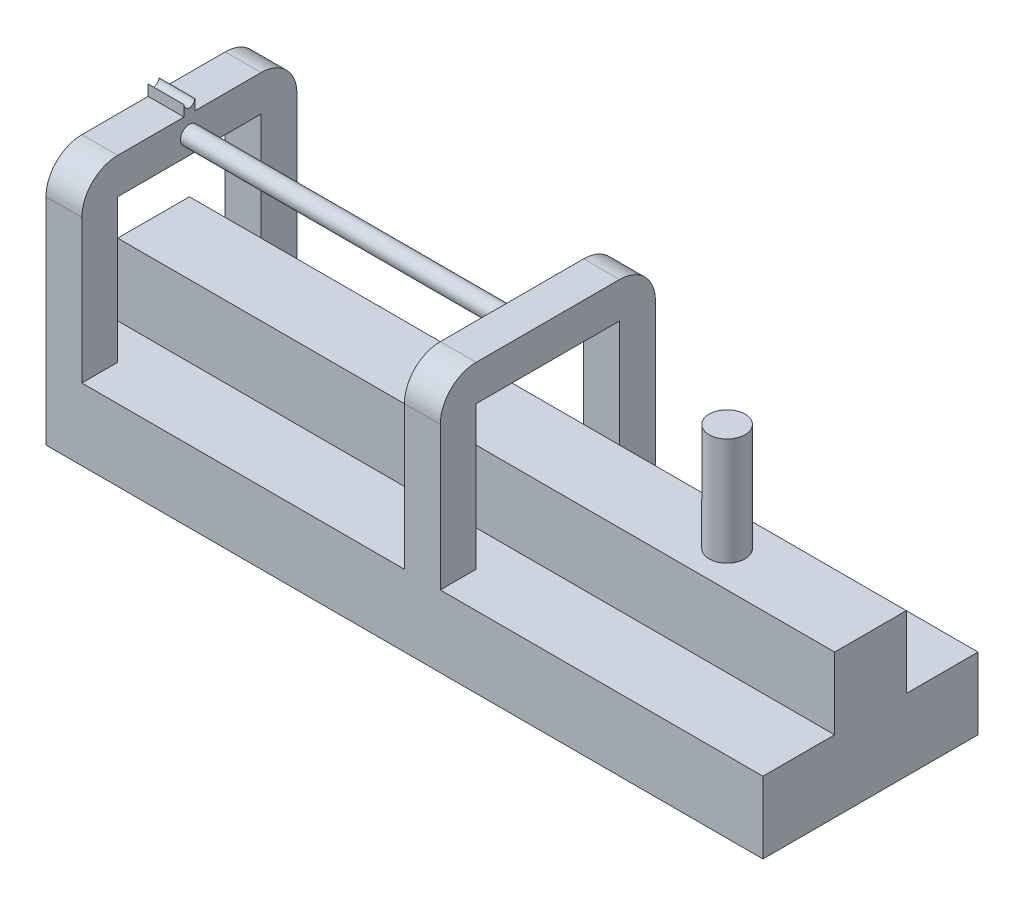
ISO-10303-21;
HEADER;
FILE_DESCRIPTION(('STEP AP214'),'2;1');
FILE_NAME('part.step','',(''),(''),'','','');
FILE_SCHEMA(('AUTOMOTIVE_DESIGN { 1 0 10303 214 1 1 1 1 }'));
ENDSEC;
DATA;
#1=APPLICATION_CONTEXT('core data for automotive mechanical design processes');
#2=APPLICATION_PROTOCOL_DEFINITION('international standard','automotive_design',2000,#1);
#3=PRODUCT_CONTEXT('',#1,'mechanical');
#4=PRODUCT('Part','Part','',(#3));
#5=PRODUCT_RELATED_PRODUCT_CATEGORY('part','',(#4));
#6=PRODUCT_DEFINITION_FORMATION('','',#4);
#7=PRODUCT_DEFINITION_CONTEXT('part definition',#1,'design');
#8=PRODUCT_DEFINITION('design','',#6,#7);
#9=PRODUCT_DEFINITION_SHAPE('','',#8);
#10=(LENGTH_UNIT() NAMED_UNIT(*) SI_UNIT(.MILLI.,.METRE.));
#11=(NAMED_UNIT(*) PLANE_ANGLE_UNIT() SI_UNIT($,.RADIAN.));
#12=(NAMED_UNIT(*) SI_UNIT($,.STERADIAN.) SOLID_ANGLE_UNIT());
#13=UNCERTAINTY_MEASURE_WITH_UNIT(LENGTH_MEASURE(1.E-05),#10,'distance_accuracy_value','');
#14=(GEOMETRIC_REPRESENTATION_CONTEXT(3) GLOBAL_UNCERTAINTY_ASSIGNED_CONTEXT((#13)) GLOBAL_UNIT_ASSIGNED_CONTEXT((#10,
#11,#12)) REPRESENTATION_CONTEXT('',''));
#15=CARTESIAN_POINT('',(0.,0.,0.));
#16=DIRECTION('',(0.,0.,1.));
#17=DIRECTION('',(1.,0.,0.));
#18=AXIS2_PLACEMENT_3D('',#15,#16,#17);
#19=CARTESIAN_POINT('',(10.,70.,-30.));
#20=DIRECTION('',(0.,1.,0.));
#21=DIRECTION('',(0.,0.,1.));
#22=AXIS2_PLACEMENT_3D('',#19,#20,#21);
#23=PLANE('',#22);
#24=DIRECTION('',(-1.,0.,0.));
#25=VECTOR('',#24,1.);
#26=CARTESIAN_POINT('',(10.,70.,1.50000000000001));
#27=LINE('',#26,#25);
#28=CARTESIAN_POINT('',(10.,70.,1.50000000000001));
#29=VERTEX_POINT('',#28);
#30=CARTESIAN_POINT('',(0.,70.,1.5));
#31=VERTEX_POINT('',#30);
#32=EDGE_CURVE('E56',#29,#31,#27,.T.);
#33=ORIENTED_EDGE('',*,*,#32,.T.);
#34=DIRECTION('',(0.,0.,-1.));
#35=VECTOR('',#34,1.);
#36=CARTESIAN_POINT('',(0.,70.,-30.));
#37=LINE('',#36,#35);
#38=CARTESIAN_POINT('',(0.,70.,20.));
#39=VERTEX_POINT('',#38);
#40=EDGE_CURVE('E332',#39,#31,#37,.T.);
#41=ORIENTED_EDGE('',*,*,#40,.F.);
#42=DIRECTION('',(-1.,0.,0.));
#43=VECTOR('',#42,1.);
#44=CARTESIAN_POINT('',(10.,70.,20.));
#45=LINE('',#44,#43);
#46=CARTESIAN_POINT('',(10.,70.,20.));
#47=VERTEX_POINT('',#46);
#48=EDGE_CURVE('E442',#39,#47,#45,.F.);
#49=ORIENTED_EDGE('',*,*,#48,.T.);
#50=DIRECTION('',(0.,0.,-1.));
#51=VECTOR('',#50,1.);
#52=CARTESIAN_POINT('',(10.,70.,-30.));
#53=LINE('',#52,#51);
#54=EDGE_CURVE('E349',#47,#29,#53,.T.);
#55=ORIENTED_EDGE('',*,*,#54,.T.);
#56=EDGE_LOOP('',(#33,#41,#49,#55));
#57=FACE_BOUND('',#56,.T.);
#58=ADVANCED_FACE('F33',(#57),#23,.T.);
#59=CARTESIAN_POINT('',(200.,0.,30.));
#60=DIRECTION('',(0.,0.,-1.));
#61=DIRECTION('',(-1.,0.,0.));
#62=AXIS2_PLACEMENT_3D('',#59,#60,#61);
#63=PLANE('',#62);
#64=DIRECTION('',(0.,1.,0.));
#65=VECTOR('',#64,1.);
#66=CARTESIAN_POINT('',(10.,20.,30.));
#67=LINE('',#66,#65);
#68=CARTESIAN_POINT('',(10.,20.,30.));
#69=VERTEX_POINT('',#68);
#70=CARTESIAN_POINT('',(10.,60.,30.));
#71=VERTEX_POINT('',#70);
#72=EDGE_CURVE('E346',#69,#71,#67,.T.);
#73=ORIENTED_EDGE('',*,*,#72,.T.);
#74=DIRECTION('',(-1.,0.,0.));
#75=VECTOR('',#74,1.);
#76=CARTESIAN_POINT('',(0.,60.,30.));
#77=LINE('',#76,#75);
#78=CARTESIAN_POINT('',(0.,60.,30.));
#79=VERTEX_POINT('',#78);
#80=EDGE_CURVE('E433',#71,#79,#77,.T.);
#81=ORIENTED_EDGE('',*,*,#80,.T.);
#82=DIRECTION('',(0.,-1.,0.));
#83=VECTOR('',#82,1.);
#84=CARTESIAN_POINT('',(0.,0.,30.));
#85=LINE('',#84,#83);
#86=CARTESIAN_POINT('',(0.,0.,30.));
#87=VERTEX_POINT('',#86);
#88=EDGE_CURVE('E364',#79,#87,#85,.T.);
#89=ORIENTED_EDGE('',*,*,#88,.T.);
#90=DIRECTION('',(-1.,0.,0.));
#91=VECTOR('',#90,1.);
#92=CARTESIAN_POINT('',(200.,0.,30.));
#93=LINE('',#92,#91);
#94=CARTESIAN_POINT('',(200.,0.,30.));
#95=VERTEX_POINT('',#94);
#96=EDGE_CURVE('E427',#95,#87,#93,.T.);
#97=ORIENTED_EDGE('',*,*,#96,.F.);
#98=DIRECTION('',(0.,-1.,0.));
#99=VECTOR('',#98,1.);
#100=CARTESIAN_POINT('',(200.,0.,30.));
#101=LINE('',#100,#99);
#102=CARTESIAN_POINT('',(200.,20.,30.));
#103=VERTEX_POINT('',#102);
#104=EDGE_CURVE('E371',#103,#95,#101,.T.);
#105=ORIENTED_EDGE('',*,*,#104,.F.);
#106=DIRECTION('',(-1.,0.,0.));
#107=VECTOR('',#106,1.);
#108=CARTESIAN_POINT('',(200.,20.,30.));
#109=LINE('',#108,#107);
#110=CARTESIAN_POINT('',(110.,20.,30.));
#111=VERTEX_POINT('',#110);
#112=EDGE_CURVE('E405',#103,#111,#109,.T.);
#113=ORIENTED_EDGE('',*,*,#112,.T.);
#114=DIRECTION('',(0.,1.,0.));
#115=VECTOR('',#114,1.);
#116=CARTESIAN_POINT('',(110.,20.,30.));
#117=LINE('',#116,#115);
#118=CARTESIAN_POINT('',(110.,60.,30.));
#119=VERTEX_POINT('',#118);
#120=EDGE_CURVE('E292',#111,#119,#117,.T.);
#121=ORIENTED_EDGE('',*,*,#120,.T.);
#122=DIRECTION('',(-1.,0.,0.));
#123=VECTOR('',#122,1.);
#124=CARTESIAN_POINT('',(100.,60.,30.));
#125=LINE('',#124,#123);
#126=CARTESIAN_POINT('',(100.,60.,30.));
#127=VERTEX_POINT('',#126);
#128=EDGE_CURVE('E430',#119,#127,#125,.T.);
#129=ORIENTED_EDGE('',*,*,#128,.T.);
#130=DIRECTION('',(0.,1.,0.));
#131=VECTOR('',#130,1.);
#132=CARTESIAN_POINT('',(100.,20.,30.));
#133=LINE('',#132,#131);
#134=CARTESIAN_POINT('',(100.,20.,30.));
#135=VERTEX_POINT('',#134);
#136=EDGE_CURVE('E315',#135,#127,#133,.T.);
#137=ORIENTED_EDGE('',*,*,#136,.F.);
#138=EDGE_CURVE('E389',#135,#69,#109,.T.);
#139=ORIENTED_EDGE('',*,*,#138,.T.);
#140=EDGE_LOOP('',(#73,#81,#89,#97,#105,#113,#121,#129,#137,#139));
#141=FACE_BOUND('',#140,.T.);
#142=ADVANCED_FACE('F478',(#141),#63,.F.);
#143=CARTESIAN_POINT('',(200.,0.,-30.));
#144=DIRECTION('',(0.,1.,0.));
#145=DIRECTION('',(0.,0.,1.));
#146=AXIS2_PLACEMENT_3D('',#143,#144,#145);
#147=PLANE('',#146);
#148=DIRECTION('',(0.,0.,-1.));
#149=VECTOR('',#148,1.);
#150=CARTESIAN_POINT('',(0.,0.,-30.));
#151=LINE('',#150,#149);
#152=CARTESIAN_POINT('',(0.,0.,-30.));
#153=VERTEX_POINT('',#152);
#154=EDGE_CURVE('E391',#87,#153,#151,.T.);
#155=ORIENTED_EDGE('',*,*,#154,.T.);
#156=DIRECTION('',(-1.,0.,0.));
#157=VECTOR('',#156,1.);
#158=CARTESIAN_POINT('',(200.,0.,-30.));
#159=LINE('',#158,#157);
#160=CARTESIAN_POINT('',(200.,0.,-30.));
#161=VERTEX_POINT('',#160);
#162=EDGE_CURVE('E424',#161,#153,#159,.T.);
#163=ORIENTED_EDGE('',*,*,#162,.F.);
#164=DIRECTION('',(0.,0.,-1.));
#165=VECTOR('',#164,1.);
#166=CARTESIAN_POINT('',(200.,0.,-30.));
#167=LINE('',#166,#165);
#168=EDGE_CURVE('E374',#95,#161,#167,.T.);
#169=ORIENTED_EDGE('',*,*,#168,.F.);
#170=ORIENTED_EDGE('',*,*,#96,.T.);
#171=EDGE_LOOP('',(#155,#163,#169,#170));
#172=FACE_BOUND('',#171,.T.);
#173=ADVANCED_FACE('F594',(#172),#147,.F.);
#174=CARTESIAN_POINT('',(200.,0.,-30.));
#175=DIRECTION('',(0.,0.,1.));
#176=DIRECTION('',(1.,0.,0.));
#177=AXIS2_PLACEMENT_3D('',#174,#175,#176);
#178=PLANE('',#177);
#179=DIRECTION('',(0.,1.,0.));
#180=VECTOR('',#179,1.);
#181=CARTESIAN_POINT('',(0.,0.,-30.));
#182=LINE('',#181,#180);
#183=CARTESIAN_POINT('',(0.,60.,-30.));
#184=VERTEX_POINT('',#183);
#185=EDGE_CURVE('E393',#153,#184,#182,.T.);
#186=ORIENTED_EDGE('',*,*,#185,.T.);
#187=DIRECTION('',(-1.,0.,0.));
#188=VECTOR('',#187,1.);
#189=CARTESIAN_POINT('',(10.,60.,-30.));
#190=LINE('',#189,#188);
#191=CARTESIAN_POINT('',(10.,60.,-30.));
#192=VERTEX_POINT('',#191);
#193=EDGE_CURVE('E450',#184,#192,#190,.F.);
#194=ORIENTED_EDGE('',*,*,#193,.T.);
#195=DIRECTION('',(0.,-1.,0.));
#196=VECTOR('',#195,1.);
#197=CARTESIAN_POINT('',(10.,20.,-30.));
#198=LINE('',#197,#196);
#199=CARTESIAN_POINT('',(10.,20.,-30.));
#200=VERTEX_POINT('',#199);
#201=EDGE_CURVE('E329',#192,#200,#198,.T.);
#202=ORIENTED_EDGE('',*,*,#201,.T.);
#203=DIRECTION('',(-1.,0.,0.));
#204=VECTOR('',#203,1.);
#205=CARTESIAN_POINT('',(200.,20.,-30.));
#206=LINE('',#205,#204);
#207=CARTESIAN_POINT('',(100.,20.,-30.));
#208=VERTEX_POINT('',#207);
#209=EDGE_CURVE('E420',#208,#200,#206,.T.);
#210=ORIENTED_EDGE('',*,*,#209,.F.);
#211=DIRECTION('',(0.,-1.,0.));
#212=VECTOR('',#211,1.);
#213=CARTESIAN_POINT('',(100.,20.,-30.));
#214=LINE('',#213,#212);
#215=CARTESIAN_POINT('',(100.,60.,-30.));
#216=VERTEX_POINT('',#215);
#217=EDGE_CURVE('E275',#216,#208,#214,.T.);
#218=ORIENTED_EDGE('',*,*,#217,.F.);
#219=DIRECTION('',(-1.,0.,0.));
#220=VECTOR('',#219,1.);
#221=CARTESIAN_POINT('',(110.,60.,-30.));
#222=LINE('',#221,#220);
#223=CARTESIAN_POINT('',(110.,60.,-30.));
#224=VERTEX_POINT('',#223);
#225=EDGE_CURVE('E448',#216,#224,#222,.F.);
#226=ORIENTED_EDGE('',*,*,#225,.T.);
#227=DIRECTION('',(0.,-1.,0.));
#228=VECTOR('',#227,1.);
#229=CARTESIAN_POINT('',(110.,20.,-30.));
#230=LINE('',#229,#228);
#231=CARTESIAN_POINT('',(110.,20.,-30.));
#232=VERTEX_POINT('',#231);
#233=EDGE_CURVE('E276',#224,#232,#230,.T.);
#234=ORIENTED_EDGE('',*,*,#233,.T.);
#235=CARTESIAN_POINT('',(200.,20.,-30.));
#236=VERTEX_POINT('',#235);
#237=EDGE_CURVE('E421',#236,#232,#206,.T.);
#238=ORIENTED_EDGE('',*,*,#237,.F.);
#239=DIRECTION('',(0.,1.,0.));
#240=VECTOR('',#239,1.);
#241=CARTESIAN_POINT('',(200.,0.,-30.));
#242=LINE('',#241,#240);
#243=EDGE_CURVE('E377',#161,#236,#242,.T.);
#244=ORIENTED_EDGE('',*,*,#243,.F.);
#245=ORIENTED_EDGE('',*,*,#162,.T.);
#246=EDGE_LOOP('',(#186,#194,#202,#210,#218,#226,#234,#238,#244,#245));
#247=FACE_BOUND('',#246,.T.);
#248=ADVANCED_FACE('F499',(#247),#178,.F.);
#249=CARTESIAN_POINT('',(200.,20.,-30.));
#250=DIRECTION('',(0.,-1.,0.));
#251=DIRECTION('',(0.,0.,-1.));
#252=AXIS2_PLACEMENT_3D('',#249,#250,#251);
#253=PLANE('',#252);
#254=ORIENTED_EDGE('',*,*,#237,.T.);
#255=DIRECTION('',(0.,0.,1.));
#256=VECTOR('',#255,1.);
#257=CARTESIAN_POINT('',(110.,20.,-30.));
#258=LINE('',#257,#256);
#259=CARTESIAN_POINT('',(110.,20.,-20.));
#260=VERTEX_POINT('',#259);
#261=EDGE_CURVE('E278',#232,#260,#258,.T.);
#262=ORIENTED_EDGE('',*,*,#261,.T.);
#263=DIRECTION('',(-1.,0.,0.));
#264=VECTOR('',#263,1.);
#265=CARTESIAN_POINT('',(110.,20.,-20.));
#266=LINE('',#265,#264);
#267=CARTESIAN_POINT('',(100.,20.,-20.));
#268=VERTEX_POINT('',#267);
#269=EDGE_CURVE('E298',#260,#268,#266,.T.);
#270=ORIENTED_EDGE('',*,*,#269,.T.);
#271=DIRECTION('',(0.,0.,1.));
#272=VECTOR('',#271,1.);
#273=CARTESIAN_POINT('',(100.,20.,-30.));
#274=LINE('',#273,#272);
#275=EDGE_CURVE('E300',#208,#268,#274,.T.);
#276=ORIENTED_EDGE('',*,*,#275,.F.);
#277=ORIENTED_EDGE('',*,*,#209,.T.);
#278=DIRECTION('',(0.,0.,1.));
#279=VECTOR('',#278,1.);
#280=CARTESIAN_POINT('',(10.,20.,-30.));
#281=LINE('',#280,#279);
#282=CARTESIAN_POINT('',(10.,20.,-20.));
#283=VERTEX_POINT('',#282);
#284=EDGE_CURVE('E331',#200,#283,#281,.T.);
#285=ORIENTED_EDGE('',*,*,#284,.T.);
#286=DIRECTION('',(-1.,0.,0.));
#287=VECTOR('',#286,1.);
#288=CARTESIAN_POINT('',(10.,20.,-20.));
#289=LINE('',#288,#287);
#290=CARTESIAN_POINT('',(0.,20.,-20.));
#291=VERTEX_POINT('',#290);
#292=EDGE_CURVE('E351',#283,#291,#289,.T.);
#293=ORIENTED_EDGE('',*,*,#292,.T.);
#294=DIRECTION('',(0.,0.,1.));
#295=VECTOR('',#294,1.);
#296=CARTESIAN_POINT('',(0.,20.,-30.));
#297=LINE('',#296,#295);
#298=CARTESIAN_POINT('',(0.,20.,-9.99999999999999));
#299=VERTEX_POINT('',#298);
#300=EDGE_CURVE('E396',#291,#299,#297,.T.);
#301=ORIENTED_EDGE('',*,*,#300,.T.);
#302=DIRECTION('',(-1.,0.,0.));
#303=VECTOR('',#302,1.);
#304=CARTESIAN_POINT('',(200.,20.,-9.99999999999999));
#305=LINE('',#304,#303);
#306=CARTESIAN_POINT('',(200.,20.,-9.99999999999999));
#307=VERTEX_POINT('',#306);
#308=EDGE_CURVE('E417',#307,#299,#305,.T.);
#309=ORIENTED_EDGE('',*,*,#308,.F.);
#310=DIRECTION('',(0.,0.,1.));
#311=VECTOR('',#310,1.);
#312=CARTESIAN_POINT('',(200.,20.,-30.));
#313=LINE('',#312,#311);
#314=EDGE_CURVE('E379',#236,#307,#313,.T.);
#315=ORIENTED_EDGE('',*,*,#314,.F.);
#316=EDGE_LOOP('',(#254,#262,#270,#276,#277,#285,#293,#301,#309,#315));
#317=FACE_BOUND('',#316,.T.);
#318=ADVANCED_FACE('F504',(#317),#253,.F.);
#319=CARTESIAN_POINT('',(200.,20.,-9.99999999999999));
#320=DIRECTION('',(0.,0.,1.));
#321=DIRECTION('',(0.,-1.,0.));
#322=AXIS2_PLACEMENT_3D('',#319,#320,#321);
#323=PLANE('',#322);
#324=DIRECTION('',(0.,1.,0.));
#325=VECTOR('',#324,1.);
#326=CARTESIAN_POINT('',(0.,20.,-9.99999999999999));
#327=LINE('',#326,#325);
#328=CARTESIAN_POINT('',(0.,40.,-10.));
#329=VERTEX_POINT('',#328);
#330=EDGE_CURVE('E398',#299,#329,#327,.T.);
#331=ORIENTED_EDGE('',*,*,#330,.T.);
#332=DIRECTION('',(-1.,0.,0.));
#333=VECTOR('',#332,1.);
#334=CARTESIAN_POINT('',(200.,40.,-10.));
#335=LINE('',#334,#333);
#336=CARTESIAN_POINT('',(200.,40.,-10.));
#337=VERTEX_POINT('',#336);
#338=EDGE_CURVE('E414',#337,#329,#335,.T.);
#339=ORIENTED_EDGE('',*,*,#338,.F.);
#340=DIRECTION('',(0.,1.,0.));
#341=VECTOR('',#340,1.);
#342=CARTESIAN_POINT('',(200.,20.,-9.99999999999999));
#343=LINE('',#342,#341);
#344=EDGE_CURVE('E381',#307,#337,#343,.T.);
#345=ORIENTED_EDGE('',*,*,#344,.F.);
#346=ORIENTED_EDGE('',*,*,#308,.T.);
#347=EDGE_LOOP('',(#331,#339,#345,#346));
#348=FACE_BOUND('',#347,.T.);
#349=ADVANCED_FACE('F520',(#348),#323,.F.);
#350=CARTESIAN_POINT('',(200.,40.,9.99999999999999));
#351=DIRECTION('',(0.,-1.,0.));
#352=DIRECTION('',(0.,0.,-1.));
#353=AXIS2_PLACEMENT_3D('',#350,#351,#352);
#354=PLANE('',#353);
#355=CARTESIAN_POINT('',(160.,40.,0.));
#356=DIRECTION('',(0.,-1.,0.));
#357=DIRECTION('',(0.,0.,-1.));
#358=AXIS2_PLACEMENT_3D('',#355,#356,#357);
#359=CIRCLE('',#358,4.99999999999999);
#360=CARTESIAN_POINT('',(160.,40.,-4.99999999999999));
#361=VERTEX_POINT('',#360);
#362=EDGE_CURVE('E11',#361,#361,#359,.F.);
#363=ORIENTED_EDGE('',*,*,#362,.F.);
#364=EDGE_LOOP('',(#363));
#365=FACE_BOUND('',#364,.T.);
#366=DIRECTION('',(0.,0.,1.));
#367=VECTOR('',#366,1.);
#368=CARTESIAN_POINT('',(0.,40.,9.99999999999999));
#369=LINE('',#368,#367);
#370=CARTESIAN_POINT('',(0.,40.,9.99999999999999));
#371=VERTEX_POINT('',#370);
#372=EDGE_CURVE('E400',#329,#371,#369,.T.);
#373=ORIENTED_EDGE('',*,*,#372,.T.);
#374=DIRECTION('',(-1.,0.,0.));
#375=VECTOR('',#374,1.);
#376=CARTESIAN_POINT('',(200.,40.,9.99999999999999));
#377=LINE('',#376,#375);
#378=CARTESIAN_POINT('',(200.,40.,9.99999999999999));
#379=VERTEX_POINT('',#378);
#380=EDGE_CURVE('E411',#379,#371,#377,.T.);
#381=ORIENTED_EDGE('',*,*,#380,.F.);
#382=DIRECTION('',(0.,0.,1.));
#383=VECTOR('',#382,1.);
#384=CARTESIAN_POINT('',(200.,40.,9.99999999999999));
#385=LINE('',#384,#383);
#386=EDGE_CURVE('E383',#337,#379,#385,.T.);
#387=ORIENTED_EDGE('',*,*,#386,.F.);
#388=ORIENTED_EDGE('',*,*,#338,.T.);
#389=EDGE_LOOP('',(#373,#381,#387,#388));
#390=FACE_BOUND('',#389,.T.);
#391=ADVANCED_FACE('F528',(#365,#390),#354,.F.);
#392=CARTESIAN_POINT('',(200.,20.,9.99999999999999));
#393=DIRECTION('',(0.,0.,-1.));
#394=DIRECTION('',(-1.,0.,0.));
#395=AXIS2_PLACEMENT_3D('',#392,#393,#394);
#396=PLANE('',#395);
#397=DIRECTION('',(0.,-1.,0.));
#398=VECTOR('',#397,1.);
#399=CARTESIAN_POINT('',(0.,20.,9.99999999999999));
#400=LINE('',#399,#398);
#401=CARTESIAN_POINT('',(0.,20.,9.99999999999999));
#402=VERTEX_POINT('',#401);
#403=EDGE_CURVE('E402',#371,#402,#400,.T.);
#404=ORIENTED_EDGE('',*,*,#403,.T.);
#405=DIRECTION('',(-1.,0.,0.));
#406=VECTOR('',#405,1.);
#407=CARTESIAN_POINT('',(200.,20.,9.99999999999999));
#408=LINE('',#407,#406);
#409=CARTESIAN_POINT('',(200.,20.,9.99999999999999));
#410=VERTEX_POINT('',#409);
#411=EDGE_CURVE('E408',#410,#402,#408,.T.);
#412=ORIENTED_EDGE('',*,*,#411,.F.);
#413=DIRECTION('',(0.,-1.,0.));
#414=VECTOR('',#413,1.);
#415=CARTESIAN_POINT('',(200.,20.,9.99999999999999));
#416=LINE('',#415,#414);
#417=EDGE_CURVE('E385',#379,#410,#416,.T.);
#418=ORIENTED_EDGE('',*,*,#417,.F.);
#419=ORIENTED_EDGE('',*,*,#380,.T.);
#420=EDGE_LOOP('',(#404,#412,#418,#419));
#421=FACE_BOUND('',#420,.T.);
#422=ADVANCED_FACE('F532',(#421),#396,.F.);
#423=CARTESIAN_POINT('',(200.,20.,30.));
#424=DIRECTION('',(0.,-1.,0.));
#425=DIRECTION('',(0.,0.,-1.));
#426=AXIS2_PLACEMENT_3D('',#423,#424,#425);
#427=PLANE('',#426);
#428=DIRECTION('',(-1.,0.,0.));
#429=VECTOR('',#428,1.);
#430=CARTESIAN_POINT('',(110.,20.,20.));
#431=LINE('',#430,#429);
#432=CARTESIAN_POINT('',(110.,20.,20.));
#433=VERTEX_POINT('',#432);
#434=CARTESIAN_POINT('',(100.,20.,20.));
#435=VERTEX_POINT('',#434);
#436=EDGE_CURVE('E320',#433,#435,#431,.T.);
#437=ORIENTED_EDGE('',*,*,#436,.F.);
#438=DIRECTION('',(0.,0.,1.));
#439=VECTOR('',#438,1.);
#440=CARTESIAN_POINT('',(110.,20.,20.));
#441=LINE('',#440,#439);
#442=EDGE_CURVE('E290',#433,#111,#441,.T.);
#443=ORIENTED_EDGE('',*,*,#442,.T.);
#444=ORIENTED_EDGE('',*,*,#112,.F.);
#445=DIRECTION('',(0.,0.,1.));
#446=VECTOR('',#445,1.);
#447=CARTESIAN_POINT('',(200.,20.,30.));
#448=LINE('',#447,#446);
#449=EDGE_CURVE('E387',#410,#103,#448,.T.);
#450=ORIENTED_EDGE('',*,*,#449,.F.);
#451=ORIENTED_EDGE('',*,*,#411,.T.);
#452=DIRECTION('',(0.,0.,1.));
#453=VECTOR('',#452,1.);
#454=CARTESIAN_POINT('',(0.,20.,30.));
#455=LINE('',#454,#453);
#456=CARTESIAN_POINT('',(0.,20.,20.));
#457=VERTEX_POINT('',#456);
#458=EDGE_CURVE('E375',#402,#457,#455,.T.);
#459=ORIENTED_EDGE('',*,*,#458,.T.);
#460=DIRECTION('',(-1.,0.,0.));
#461=VECTOR('',#460,1.);
#462=CARTESIAN_POINT('',(10.,20.,20.));
#463=LINE('',#462,#461);
#464=CARTESIAN_POINT('',(10.,20.,20.));
#465=VERTEX_POINT('',#464);
#466=EDGE_CURVE('E361',#465,#457,#463,.T.);
#467=ORIENTED_EDGE('',*,*,#466,.F.);
#468=DIRECTION('',(0.,0.,1.));
#469=VECTOR('',#468,1.);
#470=CARTESIAN_POINT('',(10.,20.,20.));
#471=LINE('',#470,#469);
#472=EDGE_CURVE('E343',#465,#69,#471,.T.);
#473=ORIENTED_EDGE('',*,*,#472,.T.);
#474=ORIENTED_EDGE('',*,*,#138,.F.);
#475=DIRECTION('',(0.,0.,1.));
#476=VECTOR('',#475,1.);
#477=CARTESIAN_POINT('',(100.,20.,20.));
#478=LINE('',#477,#476);
#479=EDGE_CURVE('E312',#435,#135,#478,.T.);
#480=ORIENTED_EDGE('',*,*,#479,.F.);
#481=EDGE_LOOP('',(#437,#443,#444,#450,#451,#459,#467,#473,#474,#480));
#482=FACE_BOUND('',#481,.T.);
#483=ADVANCED_FACE('F555',(#482),#427,.F.);
#484=CARTESIAN_POINT('',(200.,0.,0.));
#485=DIRECTION('',(-1.,0.,0.));
#486=DIRECTION('',(0.,0.,1.));
#487=AXIS2_PLACEMENT_3D('',#484,#485,#486);
#488=PLANE('',#487);
#489=ORIENTED_EDGE('',*,*,#104,.T.);
#490=ORIENTED_EDGE('',*,*,#168,.T.);
#491=ORIENTED_EDGE('',*,*,#243,.T.);
#492=ORIENTED_EDGE('',*,*,#314,.T.);
#493=ORIENTED_EDGE('',*,*,#344,.T.);
#494=ORIENTED_EDGE('',*,*,#386,.T.);
#495=ORIENTED_EDGE('',*,*,#417,.T.);
#496=ORIENTED_EDGE('',*,*,#449,.T.);
#497=EDGE_LOOP('',(#489,#490,#491,#492,#493,#494,#495,#496));
#498=FACE_BOUND('',#497,.T.);
#499=ADVANCED_FACE('F536',(#498),#488,.F.);
#500=CARTESIAN_POINT('',(0.,0.,0.));
#501=DIRECTION('',(-1.,0.,0.));
#502=DIRECTION('',(0.,0.,1.));
#503=AXIS2_PLACEMENT_3D('',#500,#501,#502);
#504=PLANE('',#503);
#505=ORIENTED_EDGE('',*,*,#88,.F.);
#506=CARTESIAN_POINT('',(0.,60.,20.));
#507=DIRECTION('',(-1.,0.,0.));
#508=DIRECTION('',(0.,0.,1.));
#509=AXIS2_PLACEMENT_3D('',#506,#507,#508);
#510=CIRCLE('',#509,10.);
#511=EDGE_CURVE('E438',#79,#39,#510,.T.);
#512=ORIENTED_EDGE('',*,*,#511,.T.);
#513=ORIENTED_EDGE('',*,*,#40,.T.);
#514=DIRECTION('',(0.,1.,0.));
#515=VECTOR('',#514,1.);
#516=CARTESIAN_POINT('',(0.,70.,1.50000000000001));
#517=LINE('',#516,#515);
#518=CARTESIAN_POINT('',(0.,73.,1.50000000000001));
#519=VERTEX_POINT('',#518);
#520=EDGE_CURVE('E257',#31,#519,#517,.T.);
#521=ORIENTED_EDGE('',*,*,#520,.T.);
#522=CARTESIAN_POINT('',(0.,73.,0.));
#523=DIRECTION('',(1.,0.,0.));
#524=DIRECTION('',(0.,0.,1.));
#525=AXIS2_PLACEMENT_3D('',#522,#523,#524);
#526=CIRCLE('',#525,1.5);
#527=CARTESIAN_POINT('',(0.,73.,-1.5));
#528=VERTEX_POINT('',#527);
#529=EDGE_CURVE('E263',#519,#528,#526,.T.);
#530=ORIENTED_EDGE('',*,*,#529,.T.);
#531=DIRECTION('',(0.,-1.,0.));
#532=VECTOR('',#531,1.);
#533=CARTESIAN_POINT('',(0.,73.,-1.5));
#534=LINE('',#533,#532);
#535=CARTESIAN_POINT('',(0.,70.,-1.49999999999999));
#536=VERTEX_POINT('',#535);
#537=EDGE_CURVE('E237',#528,#536,#534,.T.);
#538=ORIENTED_EDGE('',*,*,#537,.T.);
#539=CARTESIAN_POINT('',(0.,70.,-20.));
#540=VERTEX_POINT('',#539);
#541=EDGE_CURVE('E48',#536,#540,#37,.T.);
#542=ORIENTED_EDGE('',*,*,#541,.T.);
#543=CARTESIAN_POINT('',(0.,60.,-20.));
#544=DIRECTION('',(-1.,0.,0.));
#545=DIRECTION('',(0.,0.,1.));
#546=AXIS2_PLACEMENT_3D('',#543,#544,#545);
#547=CIRCLE('',#546,10.);
#548=EDGE_CURVE('E436',#540,#184,#547,.T.);
#549=ORIENTED_EDGE('',*,*,#548,.T.);
#550=ORIENTED_EDGE('',*,*,#185,.F.);
#551=ORIENTED_EDGE('',*,*,#154,.F.);
#552=EDGE_LOOP('',(#505,#512,#513,#521,#530,#538,#542,#549,#550,#551));
#553=FACE_BOUND('',#552,.T.);
#554=DIRECTION('',(0.,-1.,0.));
#555=VECTOR('',#554,1.);
#556=CARTESIAN_POINT('',(0.,20.,20.));
#557=LINE('',#556,#555);
#558=CARTESIAN_POINT('',(0.,60.,20.));
#559=VERTEX_POINT('',#558);
#560=EDGE_CURVE('E357',#559,#457,#557,.T.);
#561=ORIENTED_EDGE('',*,*,#560,.T.);
#562=ORIENTED_EDGE('',*,*,#458,.F.);
#563=ORIENTED_EDGE('',*,*,#403,.F.);
#564=ORIENTED_EDGE('',*,*,#372,.F.);
#565=ORIENTED_EDGE('',*,*,#330,.F.);
#566=ORIENTED_EDGE('',*,*,#300,.F.);
#567=DIRECTION('',(0.,1.,0.));
#568=VECTOR('',#567,1.);
#569=CARTESIAN_POINT('',(0.,20.,-20.));
#570=LINE('',#569,#568);
#571=CARTESIAN_POINT('',(0.,60.,-20.));
#572=VERTEX_POINT('',#571);
#573=EDGE_CURVE('E323',#291,#572,#570,.T.);
#574=ORIENTED_EDGE('',*,*,#573,.T.);
#575=DIRECTION('',(0.,0.,1.));
#576=VECTOR('',#575,1.);
#577=CARTESIAN_POINT('',(0.,60.,-20.));
#578=LINE('',#577,#576);
#579=EDGE_CURVE('E354',#572,#559,#578,.T.);
#580=ORIENTED_EDGE('',*,*,#579,.T.);
#581=EDGE_LOOP('',(#561,#562,#563,#564,#565,#566,#574,#580));
#582=FACE_BOUND('',#581,.T.);
#583=ADVANCED_FACE('F523',(#553,#582),#504,.T.);
#584=DIRECTION('',(-1.,0.,0.));
#585=VECTOR('',#584,1.);
#586=CARTESIAN_POINT('',(10.,70.,-1.5));
#587=LINE('',#586,#585);
#588=CARTESIAN_POINT('',(10.,70.,-1.5));
#589=VERTEX_POINT('',#588);
#590=EDGE_CURVE('E242',#589,#536,#587,.T.);
#591=ORIENTED_EDGE('',*,*,#590,.F.);
#592=CARTESIAN_POINT('',(10.,70.,-20.));
#593=VERTEX_POINT('',#592);
#594=EDGE_CURVE('E253',#589,#593,#53,.T.);
#595=ORIENTED_EDGE('',*,*,#594,.T.);
#596=DIRECTION('',(-1.,0.,0.));
#597=VECTOR('',#596,1.);
#598=CARTESIAN_POINT('',(0.,70.,-20.));
#599=LINE('',#598,#597);
#600=EDGE_CURVE('E440',#593,#540,#599,.T.);
#601=ORIENTED_EDGE('',*,*,#600,.T.);
#602=ORIENTED_EDGE('',*,*,#541,.F.);
#603=EDGE_LOOP('',(#591,#595,#601,#602));
#604=FACE_BOUND('',#603,.T.);
#605=ADVANCED_FACE('F574',(#604),#23,.T.);
#606=CARTESIAN_POINT('',(10.,20.,20.));
#607=DIRECTION('',(0.,0.,-1.));
#608=DIRECTION('',(-1.,0.,0.));
#609=AXIS2_PLACEMENT_3D('',#606,#607,#608);
#610=PLANE('',#609);
#611=ORIENTED_EDGE('',*,*,#560,.F.);
#612=DIRECTION('',(-1.,0.,0.));
#613=VECTOR('',#612,1.);
#614=CARTESIAN_POINT('',(10.,60.,20.));
#615=LINE('',#614,#613);
#616=CARTESIAN_POINT('',(10.,60.,20.));
#617=VERTEX_POINT('',#616);
#618=EDGE_CURVE('E365',#617,#559,#615,.T.);
#619=ORIENTED_EDGE('',*,*,#618,.F.);
#620=DIRECTION('',(0.,-1.,0.));
#621=VECTOR('',#620,1.);
#622=CARTESIAN_POINT('',(10.,20.,20.));
#623=LINE('',#622,#621);
#624=EDGE_CURVE('E340',#617,#465,#623,.T.);
#625=ORIENTED_EDGE('',*,*,#624,.T.);
#626=ORIENTED_EDGE('',*,*,#466,.T.);
#627=EDGE_LOOP('',(#611,#619,#625,#626));
#628=FACE_BOUND('',#627,.T.);
#629=ADVANCED_FACE('F576',(#628),#610,.T.);
#630=CARTESIAN_POINT('',(10.,60.,-20.));
#631=DIRECTION('',(0.,-1.,0.));
#632=DIRECTION('',(0.,0.,-1.));
#633=AXIS2_PLACEMENT_3D('',#630,#631,#632);
#634=PLANE('',#633);
#635=ORIENTED_EDGE('',*,*,#579,.F.);
#636=DIRECTION('',(-1.,0.,0.));
#637=VECTOR('',#636,1.);
#638=CARTESIAN_POINT('',(10.,60.,-20.));
#639=LINE('',#638,#637);
#640=CARTESIAN_POINT('',(10.,60.,-20.));
#641=VERTEX_POINT('',#640);
#642=EDGE_CURVE('E367',#641,#572,#639,.T.);
#643=ORIENTED_EDGE('',*,*,#642,.F.);
#644=DIRECTION('',(0.,0.,1.));
#645=VECTOR('',#644,1.);
#646=CARTESIAN_POINT('',(10.,60.,-20.));
#647=LINE('',#646,#645);
#648=EDGE_CURVE('E337',#641,#617,#647,.T.);
#649=ORIENTED_EDGE('',*,*,#648,.T.);
#650=ORIENTED_EDGE('',*,*,#618,.T.);
#651=EDGE_LOOP('',(#635,#643,#649,#650));
#652=FACE_BOUND('',#651,.T.);
#653=ADVANCED_FACE('F583',(#652),#634,.T.);
#654=CARTESIAN_POINT('',(10.,20.,-20.));
#655=DIRECTION('',(0.,0.,1.));
#656=DIRECTION('',(1.,0.,0.));
#657=AXIS2_PLACEMENT_3D('',#654,#655,#656);
#658=PLANE('',#657);
#659=ORIENTED_EDGE('',*,*,#573,.F.);
#660=ORIENTED_EDGE('',*,*,#292,.F.);
#661=DIRECTION('',(0.,1.,0.));
#662=VECTOR('',#661,1.);
#663=CARTESIAN_POINT('',(10.,20.,-20.));
#664=LINE('',#663,#662);
#665=EDGE_CURVE('E334',#283,#641,#664,.T.);
#666=ORIENTED_EDGE('',*,*,#665,.T.);
#667=ORIENTED_EDGE('',*,*,#642,.T.);
#668=EDGE_LOOP('',(#659,#660,#666,#667));
#669=FACE_BOUND('',#668,.T.);
#670=ADVANCED_FACE('F512',(#669),#658,.T.);
#671=CARTESIAN_POINT('',(10.,0.,0.));
#672=DIRECTION('',(1.,0.,0.));
#673=DIRECTION('',(0.,0.,-1.));
#674=AXIS2_PLACEMENT_3D('',#671,#672,#673);
#675=PLANE('',#674);
#676=CARTESIAN_POINT('',(10.,65.,0.));
#677=DIRECTION('',(1.,0.,0.));
#678=DIRECTION('',(0.,0.,-1.));
#679=AXIS2_PLACEMENT_3D('',#676,#677,#678);
#680=CIRCLE('',#679,2.5);
#681=CARTESIAN_POINT('',(10.,65.,-2.5));
#682=VERTEX_POINT('',#681);
#683=EDGE_CURVE('E272',#682,#682,#680,.T.);
#684=ORIENTED_EDGE('',*,*,#683,.F.);
#685=EDGE_LOOP('',(#684));
#686=FACE_BOUND('',#685,.T.);
#687=ORIENTED_EDGE('',*,*,#54,.F.);
#688=CARTESIAN_POINT('',(10.,60.,20.));
#689=DIRECTION('',(1.,0.,0.));
#690=DIRECTION('',(0.,0.,-1.));
#691=AXIS2_PLACEMENT_3D('',#688,#689,#690);
#692=CIRCLE('',#691,10.);
#693=EDGE_CURVE('E446',#47,#71,#692,.T.);
#694=ORIENTED_EDGE('',*,*,#693,.T.);
#695=ORIENTED_EDGE('',*,*,#72,.F.);
#696=ORIENTED_EDGE('',*,*,#472,.F.);
#697=ORIENTED_EDGE('',*,*,#624,.F.);
#698=ORIENTED_EDGE('',*,*,#648,.F.);
#699=ORIENTED_EDGE('',*,*,#665,.F.);
#700=ORIENTED_EDGE('',*,*,#284,.F.);
#701=ORIENTED_EDGE('',*,*,#201,.F.);
#702=CARTESIAN_POINT('',(10.,60.,-20.));
#703=DIRECTION('',(1.,0.,0.));
#704=DIRECTION('',(0.,0.,-1.));
#705=AXIS2_PLACEMENT_3D('',#702,#703,#704);
#706=CIRCLE('',#705,10.);
#707=EDGE_CURVE('E444',#192,#593,#706,.T.);
#708=ORIENTED_EDGE('',*,*,#707,.T.);
#709=ORIENTED_EDGE('',*,*,#594,.F.);
#710=DIRECTION('',(0.,-1.,0.));
#711=VECTOR('',#710,1.);
#712=CARTESIAN_POINT('',(10.,73.,-1.5));
#713=LINE('',#712,#711);
#714=CARTESIAN_POINT('',(10.,73.,-1.5));
#715=VERTEX_POINT('',#714);
#716=EDGE_CURVE('E235',#715,#589,#713,.T.);
#717=ORIENTED_EDGE('',*,*,#716,.F.);
#718=CARTESIAN_POINT('',(10.,73.,0.));
#719=DIRECTION('',(1.,0.,0.));
#720=DIRECTION('',(0.,0.,1.));
#721=AXIS2_PLACEMENT_3D('',#718,#719,#720);
#722=CIRCLE('',#721,1.5);
#723=CARTESIAN_POINT('',(10.,73.,1.50000000000001));
#724=VERTEX_POINT('',#723);
#725=EDGE_CURVE('E250',#724,#715,#722,.T.);
#726=ORIENTED_EDGE('',*,*,#725,.F.);
#727=DIRECTION('',(0.,1.,0.));
#728=VECTOR('',#727,1.);
#729=CARTESIAN_POINT('',(10.,70.,1.50000000000001));
#730=LINE('',#729,#728);
#731=EDGE_CURVE('E243',#29,#724,#730,.T.);
#732=ORIENTED_EDGE('',*,*,#731,.F.);
#733=EDGE_LOOP('',(#687,#694,#695,#696,#697,#698,#699,#700,#701,#708,#709,#717,#726,#732));
#734=FACE_BOUND('',#733,.T.);
#735=ADVANCED_FACE('F248',(#686,#734),#675,.T.);
#736=CARTESIAN_POINT('',(110.,70.,-30.));
#737=DIRECTION('',(0.,1.,0.));
#738=DIRECTION('',(0.,0.,1.));
#739=AXIS2_PLACEMENT_3D('',#736,#737,#738);
#740=PLANE('',#739);
#741=DIRECTION('',(0.,0.,-1.));
#742=VECTOR('',#741,1.);
#743=CARTESIAN_POINT('',(100.,70.,-30.));
#744=LINE('',#743,#742);
#745=CARTESIAN_POINT('',(100.,70.,20.));
#746=VERTEX_POINT('',#745);
#747=CARTESIAN_POINT('',(100.,70.,-20.));
#748=VERTEX_POINT('',#747);
#749=EDGE_CURVE('E279',#746,#748,#744,.T.);
#750=ORIENTED_EDGE('',*,*,#749,.F.);
#751=DIRECTION('',(-1.,0.,0.));
#752=VECTOR('',#751,1.);
#753=CARTESIAN_POINT('',(110.,70.,20.));
#754=LINE('',#753,#752);
#755=CARTESIAN_POINT('',(110.,70.,20.));
#756=VERTEX_POINT('',#755);
#757=EDGE_CURVE('E459',#746,#756,#754,.F.);
#758=ORIENTED_EDGE('',*,*,#757,.T.);
#759=DIRECTION('',(0.,0.,-1.));
#760=VECTOR('',#759,1.);
#761=CARTESIAN_POINT('',(110.,70.,-30.));
#762=LINE('',#761,#760);
#763=CARTESIAN_POINT('',(110.,70.,-20.));
#764=VERTEX_POINT('',#763);
#765=EDGE_CURVE('E295',#756,#764,#762,.T.);
#766=ORIENTED_EDGE('',*,*,#765,.T.);
#767=DIRECTION('',(-1.,0.,0.));
#768=VECTOR('',#767,1.);
#769=CARTESIAN_POINT('',(100.,70.,-20.));
#770=LINE('',#769,#768);
#771=EDGE_CURVE('E456',#764,#748,#770,.T.);
#772=ORIENTED_EDGE('',*,*,#771,.T.);
#773=EDGE_LOOP('',(#750,#758,#766,#772));
#774=FACE_BOUND('',#773,.T.);
#775=ADVANCED_FACE('F487',(#774),#740,.T.);
#776=CARTESIAN_POINT('',(110.,20.,20.));
#777=DIRECTION('',(0.,0.,-1.));
#778=DIRECTION('',(-1.,0.,0.));
#779=AXIS2_PLACEMENT_3D('',#776,#777,#778);
#780=PLANE('',#779);
#781=DIRECTION('',(0.,-1.,0.));
#782=VECTOR('',#781,1.);
#783=CARTESIAN_POINT('',(100.,20.,20.));
#784=LINE('',#783,#782);
#785=CARTESIAN_POINT('',(100.,60.,20.));
#786=VERTEX_POINT('',#785);
#787=EDGE_CURVE('E309',#786,#435,#784,.T.);
#788=ORIENTED_EDGE('',*,*,#787,.F.);
#789=DIRECTION('',(-1.,0.,0.));
#790=VECTOR('',#789,1.);
#791=CARTESIAN_POINT('',(110.,60.,20.));
#792=LINE('',#791,#790);
#793=CARTESIAN_POINT('',(110.,60.,20.));
#794=VERTEX_POINT('',#793);
#795=EDGE_CURVE('E324',#794,#786,#792,.T.);
#796=ORIENTED_EDGE('',*,*,#795,.F.);
#797=DIRECTION('',(0.,-1.,0.));
#798=VECTOR('',#797,1.);
#799=CARTESIAN_POINT('',(110.,20.,20.));
#800=LINE('',#799,#798);
#801=EDGE_CURVE('E287',#794,#433,#800,.T.);
#802=ORIENTED_EDGE('',*,*,#801,.T.);
#803=ORIENTED_EDGE('',*,*,#436,.T.);
#804=EDGE_LOOP('',(#788,#796,#802,#803));
#805=FACE_BOUND('',#804,.T.);
#806=ADVANCED_FACE('F552',(#805),#780,.T.);
#807=CARTESIAN_POINT('',(110.,60.,-20.));
#808=DIRECTION('',(0.,-1.,0.));
#809=DIRECTION('',(0.,0.,-1.));
#810=AXIS2_PLACEMENT_3D('',#807,#808,#809);
#811=PLANE('',#810);
#812=DIRECTION('',(0.,0.,1.));
#813=VECTOR('',#812,1.);
#814=CARTESIAN_POINT('',(100.,60.,-20.));
#815=LINE('',#814,#813);
#816=CARTESIAN_POINT('',(100.,60.,-20.));
#817=VERTEX_POINT('',#816);
#818=EDGE_CURVE('E306',#817,#786,#815,.T.);
#819=ORIENTED_EDGE('',*,*,#818,.F.);
#820=DIRECTION('',(-1.,0.,0.));
#821=VECTOR('',#820,1.);
#822=CARTESIAN_POINT('',(110.,60.,-20.));
#823=LINE('',#822,#821);
#824=CARTESIAN_POINT('',(110.,60.,-20.));
#825=VERTEX_POINT('',#824);
#826=EDGE_CURVE('E326',#825,#817,#823,.T.);
#827=ORIENTED_EDGE('',*,*,#826,.F.);
#828=DIRECTION('',(0.,0.,1.));
#829=VECTOR('',#828,1.);
#830=CARTESIAN_POINT('',(110.,60.,-20.));
#831=LINE('',#830,#829);
#832=EDGE_CURVE('E284',#825,#794,#831,.T.);
#833=ORIENTED_EDGE('',*,*,#832,.T.);
#834=ORIENTED_EDGE('',*,*,#795,.T.);
#835=EDGE_LOOP('',(#819,#827,#833,#834));
#836=FACE_BOUND('',#835,.T.);
#837=ADVANCED_FACE('F550',(#836),#811,.T.);
#838=CARTESIAN_POINT('',(110.,20.,-20.));
#839=DIRECTION('',(0.,0.,1.));
#840=DIRECTION('',(1.,0.,0.));
#841=AXIS2_PLACEMENT_3D('',#838,#839,#840);
#842=PLANE('',#841);
#843=DIRECTION('',(0.,1.,0.));
#844=VECTOR('',#843,1.);
#845=CARTESIAN_POINT('',(100.,20.,-20.));
#846=LINE('',#845,#844);
#847=EDGE_CURVE('E303',#268,#817,#846,.T.);
#848=ORIENTED_EDGE('',*,*,#847,.F.);
#849=ORIENTED_EDGE('',*,*,#269,.F.);
#850=DIRECTION('',(0.,1.,0.));
#851=VECTOR('',#850,1.);
#852=CARTESIAN_POINT('',(110.,20.,-20.));
#853=LINE('',#852,#851);
#854=EDGE_CURVE('E281',#260,#825,#853,.T.);
#855=ORIENTED_EDGE('',*,*,#854,.T.);
#856=ORIENTED_EDGE('',*,*,#826,.T.);
#857=EDGE_LOOP('',(#848,#849,#855,#856));
#858=FACE_BOUND('',#857,.T.);
#859=ADVANCED_FACE('F546',(#858),#842,.T.);
#860=CARTESIAN_POINT('',(110.,0.,0.));
#861=DIRECTION('',(1.,0.,0.));
#862=DIRECTION('',(0.,0.,-1.));
#863=AXIS2_PLACEMENT_3D('',#860,#861,#862);
#864=PLANE('',#863);
#865=ORIENTED_EDGE('',*,*,#765,.F.);
#866=CARTESIAN_POINT('',(110.,60.,20.));
#867=DIRECTION('',(1.,0.,0.));
#868=DIRECTION('',(0.,0.,-1.));
#869=AXIS2_PLACEMENT_3D('',#866,#867,#868);
#870=CIRCLE('',#869,10.);
#871=EDGE_CURVE('E463',#756,#119,#870,.T.);
#872=ORIENTED_EDGE('',*,*,#871,.T.);
#873=ORIENTED_EDGE('',*,*,#120,.F.);
#874=ORIENTED_EDGE('',*,*,#442,.F.);
#875=ORIENTED_EDGE('',*,*,#801,.F.);
#876=ORIENTED_EDGE('',*,*,#832,.F.);
#877=ORIENTED_EDGE('',*,*,#854,.F.);
#878=ORIENTED_EDGE('',*,*,#261,.F.);
#879=ORIENTED_EDGE('',*,*,#233,.F.);
#880=CARTESIAN_POINT('',(110.,60.,-20.));
#881=DIRECTION('',(1.,0.,0.));
#882=DIRECTION('',(0.,0.,-1.));
#883=AXIS2_PLACEMENT_3D('',#880,#881,#882);
#884=CIRCLE('',#883,10.);
#885=EDGE_CURVE('E461',#224,#764,#884,.T.);
#886=ORIENTED_EDGE('',*,*,#885,.T.);
#887=EDGE_LOOP('',(#865,#872,#873,#874,#875,#876,#877,#878,#879,#886));
#888=FACE_BOUND('',#887,.T.);
#889=ADVANCED_FACE('F473',(#888),#864,.T.);
#890=CARTESIAN_POINT('',(100.,0.,0.));
#891=DIRECTION('',(1.,0.,0.));
#892=DIRECTION('',(0.,0.,-1.));
#893=AXIS2_PLACEMENT_3D('',#890,#891,#892);
#894=PLANE('',#893);
#895=CARTESIAN_POINT('',(100.,65.,0.));
#896=DIRECTION('',(1.,0.,0.));
#897=DIRECTION('',(0.,0.,-1.));
#898=AXIS2_PLACEMENT_3D('',#895,#896,#897);
#899=CIRCLE('',#898,2.5);
#900=CARTESIAN_POINT('',(100.,65.,-2.5));
#901=VERTEX_POINT('',#900);
#902=EDGE_CURVE('E41',#901,#901,#899,.F.);
#903=ORIENTED_EDGE('',*,*,#902,.F.);
#904=EDGE_LOOP('',(#903));
#905=FACE_BOUND('',#904,.T.);
#906=ORIENTED_EDGE('',*,*,#136,.T.);
#907=CARTESIAN_POINT('',(100.,60.,20.));
#908=DIRECTION('',(1.,0.,0.));
#909=DIRECTION('',(0.,0.,-1.));
#910=AXIS2_PLACEMENT_3D('',#907,#908,#909);
#911=CIRCLE('',#910,10.);
#912=EDGE_CURVE('E454',#127,#746,#911,.F.);
#913=ORIENTED_EDGE('',*,*,#912,.T.);
#914=ORIENTED_EDGE('',*,*,#749,.T.);
#915=CARTESIAN_POINT('',(100.,60.,-20.));
#916=DIRECTION('',(1.,0.,0.));
#917=DIRECTION('',(0.,0.,-1.));
#918=AXIS2_PLACEMENT_3D('',#915,#916,#917);
#919=CIRCLE('',#918,10.);
#920=EDGE_CURVE('E452',#748,#216,#919,.F.);
#921=ORIENTED_EDGE('',*,*,#920,.T.);
#922=ORIENTED_EDGE('',*,*,#217,.T.);
#923=ORIENTED_EDGE('',*,*,#275,.T.);
#924=ORIENTED_EDGE('',*,*,#847,.T.);
#925=ORIENTED_EDGE('',*,*,#818,.T.);
#926=ORIENTED_EDGE('',*,*,#787,.T.);
#927=ORIENTED_EDGE('',*,*,#479,.T.);
#928=EDGE_LOOP('',(#906,#913,#914,#921,#922,#923,#924,#925,#926,#927));
#929=FACE_BOUND('',#928,.T.);
#930=ADVANCED_FACE('F469',(#905,#929),#894,.F.);
#931=CARTESIAN_POINT('',(200.,60.,20.));
#932=DIRECTION('',(1.,0.,0.));
#933=DIRECTION('',(0.,0.,-1.));
#934=AXIS2_PLACEMENT_3D('',#931,#932,#933);
#935=CYLINDRICAL_SURFACE('',#934,10.);
#936=ORIENTED_EDGE('',*,*,#693,.F.);
#937=ORIENTED_EDGE('',*,*,#48,.F.);
#938=ORIENTED_EDGE('',*,*,#511,.F.);
#939=ORIENTED_EDGE('',*,*,#80,.F.);
#940=EDGE_LOOP('',(#936,#937,#938,#939));
#941=FACE_BOUND('',#940,.T.);
#942=ADVANCED_FACE('F472',(#941),#935,.T.);
#943=CARTESIAN_POINT('',(10.,60.,-20.));
#944=DIRECTION('',(1.,0.,0.));
#945=DIRECTION('',(0.,0.,-1.));
#946=AXIS2_PLACEMENT_3D('',#943,#944,#945);
#947=CYLINDRICAL_SURFACE('',#946,10.);
#948=ORIENTED_EDGE('',*,*,#707,.F.);
#949=ORIENTED_EDGE('',*,*,#193,.F.);
#950=ORIENTED_EDGE('',*,*,#548,.F.);
#951=ORIENTED_EDGE('',*,*,#600,.F.);
#952=EDGE_LOOP('',(#948,#949,#950,#951));
#953=FACE_BOUND('',#952,.T.);
#954=ADVANCED_FACE('F573',(#953),#947,.T.);
#955=CARTESIAN_POINT('',(200.,60.,20.));
#956=DIRECTION('',(1.,0.,0.));
#957=DIRECTION('',(0.,0.,-1.));
#958=AXIS2_PLACEMENT_3D('',#955,#956,#957);
#959=CYLINDRICAL_SURFACE('',#958,10.);
#960=ORIENTED_EDGE('',*,*,#871,.F.);
#961=ORIENTED_EDGE('',*,*,#757,.F.);
#962=ORIENTED_EDGE('',*,*,#912,.F.);
#963=ORIENTED_EDGE('',*,*,#128,.F.);
#964=EDGE_LOOP('',(#960,#961,#962,#963));
#965=FACE_BOUND('',#964,.T.);
#966=ADVANCED_FACE('F483',(#965),#959,.T.);
#967=CARTESIAN_POINT('',(110.,60.,-20.));
#968=DIRECTION('',(1.,0.,0.));
#969=DIRECTION('',(0.,0.,-1.));
#970=AXIS2_PLACEMENT_3D('',#967,#968,#969);
#971=CYLINDRICAL_SURFACE('',#970,10.);
#972=ORIENTED_EDGE('',*,*,#885,.F.);
#973=ORIENTED_EDGE('',*,*,#225,.F.);
#974=ORIENTED_EDGE('',*,*,#920,.F.);
#975=ORIENTED_EDGE('',*,*,#771,.F.);
#976=EDGE_LOOP('',(#972,#973,#974,#975));
#977=FACE_BOUND('',#976,.T.);
#978=ADVANCED_FACE('F35',(#977),#971,.T.);
#979=CARTESIAN_POINT('',(200.002,65.,0.));
#980=DIRECTION('',(-1.,0.,0.));
#981=DIRECTION('',(0.,0.,1.));
#982=AXIS2_PLACEMENT_3D('',#979,#980,#981);
#983=CYLINDRICAL_SURFACE('',#982,2.5);
#984=ORIENTED_EDGE('',*,*,#683,.T.);
#985=EDGE_LOOP('',(#984));
#986=FACE_BOUND('',#985,.T.);
#987=ORIENTED_EDGE('',*,*,#902,.T.);
#988=EDGE_LOOP('',(#987));
#989=FACE_BOUND('',#988,.T.);
#990=ADVANCED_FACE('F467',(#986,#989),#983,.T.);
#991=CARTESIAN_POINT('',(160.,84.1421356237309,0.));
#992=DIRECTION('',(0.,-1.,0.));
#993=DIRECTION('',(0.,0.,-1.));
#994=AXIS2_PLACEMENT_3D('',#991,#992,#993);
#995=CYLINDRICAL_SURFACE('',#994,4.99999999999999);
#996=ORIENTED_EDGE('',*,*,#362,.T.);
#997=EDGE_LOOP('',(#996));
#998=FACE_BOUND('',#997,.T.);
#999=CARTESIAN_POINT('',(160.,70.,0.));
#1000=DIRECTION('',(0.,1.,0.));
#1001=DIRECTION('',(0.,0.,1.));
#1002=AXIS2_PLACEMENT_3D('',#999,#1000,#1001);
#1003=CIRCLE('',#1002,4.99999999999999);
#1004=CARTESIAN_POINT('',(160.,70.,4.99999999999999));
#1005=VERTEX_POINT('',#1004);
#1006=EDGE_CURVE('E267',#1005,#1005,#1003,.T.);
#1007=ORIENTED_EDGE('',*,*,#1006,.F.);
#1008=EDGE_LOOP('',(#1007));
#1009=FACE_BOUND('',#1008,.T.);
#1010=ADVANCED_FACE('F613',(#998,#1009),#995,.T.);
#1011=CARTESIAN_POINT('',(110.,70.,-30.));
#1012=DIRECTION('',(0.,1.,0.));
#1013=DIRECTION('',(0.,0.,1.));
#1014=AXIS2_PLACEMENT_3D('',#1011,#1012,#1013);
#1015=PLANE('',#1014);
#1016=ORIENTED_EDGE('',*,*,#1006,.T.);
#1017=EDGE_LOOP('',(#1016));
#1018=FACE_BOUND('',#1017,.T.);
#1019=ADVANCED_FACE('F619',(#1018),#1015,.T.);
#1020=CARTESIAN_POINT('',(10.,73.,0.));
#1021=DIRECTION('',(-1.,0.,0.));
#1022=DIRECTION('',(0.,0.,1.));
#1023=AXIS2_PLACEMENT_3D('',#1020,#1021,#1022);
#1024=CYLINDRICAL_SURFACE('',#1023,1.5);
#1025=ORIENTED_EDGE('',*,*,#529,.F.);
#1026=DIRECTION('',(-1.,0.,0.));
#1027=VECTOR('',#1026,1.);
#1028=CARTESIAN_POINT('',(10.,73.,1.50000000000001));
#1029=LINE('',#1028,#1027);
#1030=EDGE_CURVE('E256',#724,#519,#1029,.T.);
#1031=ORIENTED_EDGE('',*,*,#1030,.F.);
#1032=ORIENTED_EDGE('',*,*,#725,.T.);
#1033=DIRECTION('',(-1.,0.,0.));
#1034=VECTOR('',#1033,1.);
#1035=CARTESIAN_POINT('',(10.,73.,-1.5));
#1036=LINE('',#1035,#1034);
#1037=EDGE_CURVE('E232',#715,#528,#1036,.T.);
#1038=ORIENTED_EDGE('',*,*,#1037,.T.);
#1039=EDGE_LOOP('',(#1025,#1031,#1032,#1038));
#1040=FACE_BOUND('',#1039,.T.);
#1041=ADVANCED_FACE('F255',(#1040),#1024,.F.);
#1042=CARTESIAN_POINT('',(10.,70.,1.50000000000001));
#1043=DIRECTION('',(0.,0.,1.));
#1044=DIRECTION('',(0.,-1.,0.));
#1045=AXIS2_PLACEMENT_3D('',#1042,#1043,#1044);
#1046=PLANE('',#1045);
#1047=ORIENTED_EDGE('',*,*,#520,.F.);
#1048=ORIENTED_EDGE('',*,*,#32,.F.);
#1049=ORIENTED_EDGE('',*,*,#731,.T.);
#1050=ORIENTED_EDGE('',*,*,#1030,.T.);
#1051=EDGE_LOOP('',(#1047,#1048,#1049,#1050));
#1052=FACE_BOUND('',#1051,.T.);
#1053=ADVANCED_FACE('F567',(#1052),#1046,.T.);
#1054=CARTESIAN_POINT('',(10.,73.,-1.5));
#1055=DIRECTION('',(0.,0.,-1.));
#1056=DIRECTION('',(0.,1.,0.));
#1057=AXIS2_PLACEMENT_3D('',#1054,#1055,#1056);
#1058=PLANE('',#1057);
#1059=ORIENTED_EDGE('',*,*,#537,.F.);
#1060=ORIENTED_EDGE('',*,*,#1037,.F.);
#1061=ORIENTED_EDGE('',*,*,#716,.T.);
#1062=ORIENTED_EDGE('',*,*,#590,.T.);
#1063=EDGE_LOOP('',(#1059,#1060,#1061,#1062));
#1064=FACE_BOUND('',#1063,.T.);
#1065=ADVANCED_FACE('F234',(#1064),#1058,.T.);
#1066=CLOSED_SHELL('',(#58,#142,#173,#248,#318,#349,#391,#422,#483,#499,#583,#605,#629,#653,
#670,#735,#775,#806,#837,#859,#889,#930,#942,#954,#966,#978,#990,#1010,#1019,#1041,#1053,#1065));
#1067=MANIFOLD_SOLID_BREP('B2',#1066);
#1068=ADVANCED_BREP_SHAPE_REPRESENTATION('',(#18,#1067),#14);
#1069=SHAPE_DEFINITION_REPRESENTATION(#9,#1068);
ENDSEC;
END-ISO-10303-21;
